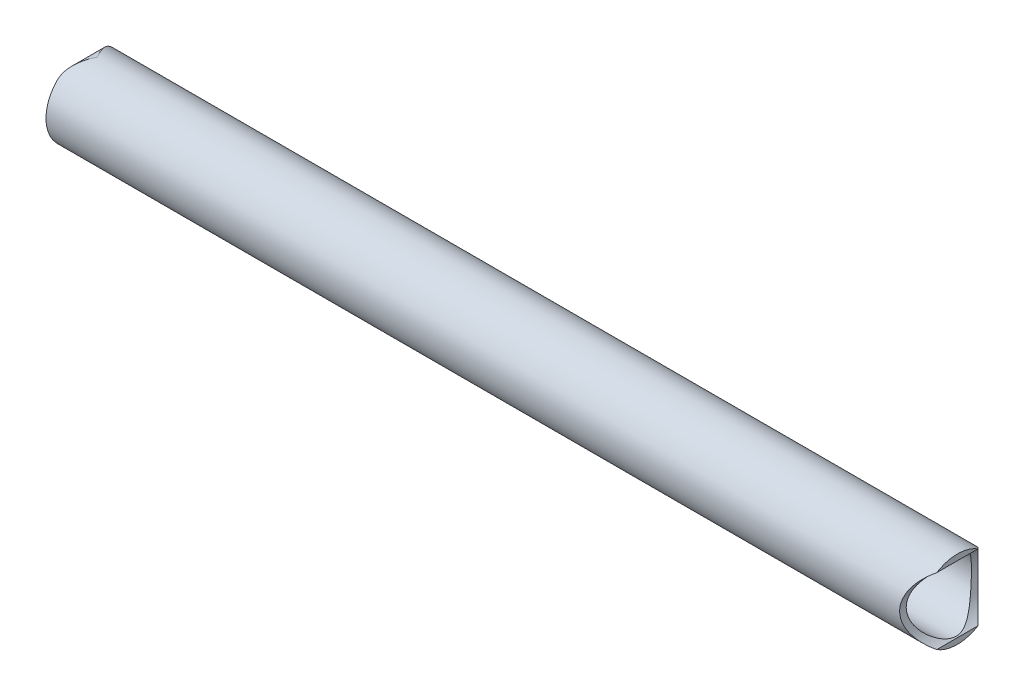
ISO-10303-21;
HEADER;
FILE_DESCRIPTION(('STEP AP214'),'2;1');
FILE_NAME('part.step','',(''),(''),'','','');
FILE_SCHEMA(('AUTOMOTIVE_DESIGN { 1 0 10303 214 1 1 1 1 }'));
ENDSEC;
DATA;
#1=APPLICATION_CONTEXT('core data for automotive mechanical design processes');
#2=APPLICATION_PROTOCOL_DEFINITION('international standard','automotive_design',2000,#1);
#3=PRODUCT_CONTEXT('',#1,'mechanical');
#4=PRODUCT('Part','Part','',(#3));
#5=PRODUCT_RELATED_PRODUCT_CATEGORY('part','',(#4));
#6=PRODUCT_DEFINITION_FORMATION('','',#4);
#7=PRODUCT_DEFINITION_CONTEXT('part definition',#1,'design');
#8=PRODUCT_DEFINITION('design','',#6,#7);
#9=PRODUCT_DEFINITION_SHAPE('','',#8);
#10=(LENGTH_UNIT() NAMED_UNIT(*) SI_UNIT(.MILLI.,.METRE.));
#11=(NAMED_UNIT(*) PLANE_ANGLE_UNIT() SI_UNIT($,.RADIAN.));
#12=(NAMED_UNIT(*) SI_UNIT($,.STERADIAN.) SOLID_ANGLE_UNIT());
#13=UNCERTAINTY_MEASURE_WITH_UNIT(LENGTH_MEASURE(1.E-05),#10,'distance_accuracy_value','');
#14=(GEOMETRIC_REPRESENTATION_CONTEXT(3) GLOBAL_UNCERTAINTY_ASSIGNED_CONTEXT((#13)) GLOBAL_UNIT_ASSIGNED_CONTEXT((#10,
#11,#12)) REPRESENTATION_CONTEXT('',''));
#15=CARTESIAN_POINT('',(0.,0.,0.));
#16=DIRECTION('',(0.,0.,1.));
#17=DIRECTION('',(1.,0.,0.));
#18=AXIS2_PLACEMENT_3D('',#15,#16,#17);
#19=CARTESIAN_POINT('',(469.10625,0.,0.));
#20=DIRECTION('',(1.,0.,0.));
#21=DIRECTION('',(0.,0.,-1.));
#22=AXIS2_PLACEMENT_3D('',#19,#20,#21);
#23=PLANE('',#22);
#24=DIRECTION('',(0.,0.,1.));
#25=VECTOR('',#24,1.);
#26=CARTESIAN_POINT('',(469.10625,17.9154421589309,-21.082));
#27=LINE('',#26,#25);
#28=CARTESIAN_POINT('',(469.10625,17.9154421589309,-11.1125));
#29=VERTEX_POINT('',#28);
#30=CARTESIAN_POINT('',(469.10625,17.915442158931,11.1125));
#31=VERTEX_POINT('',#30);
#32=EDGE_CURVE('E99',#29,#31,#27,.T.);
#33=ORIENTED_EDGE('',*,*,#32,.F.);
#34=CARTESIAN_POINT('',(469.10625,0.,0.));
#35=DIRECTION('',(1.,0.,0.));
#36=DIRECTION('',(0.,0.,-1.));
#37=AXIS2_PLACEMENT_3D('',#34,#35,#36);
#38=CIRCLE('',#37,21.082);
#39=EDGE_CURVE('E59',#29,#31,#38,.T.);
#40=ORIENTED_EDGE('',*,*,#39,.T.);
#41=EDGE_LOOP('',(#33,#40));
#42=FACE_BOUND('',#41,.T.);
#43=ADVANCED_FACE('F44',(#42),#23,.T.);
#44=DIRECTION('',(0.,0.,1.));
#45=VECTOR('',#44,1.);
#46=CARTESIAN_POINT('',(469.10625,-17.9154421589309,-21.082));
#47=LINE('',#46,#45);
#48=CARTESIAN_POINT('',(469.10625,-17.915442158931,11.1125));
#49=VERTEX_POINT('',#48);
#50=CARTESIAN_POINT('',(469.10625,-17.9154421589309,-11.1125));
#51=VERTEX_POINT('',#50);
#52=EDGE_CURVE('E96',#49,#51,#47,.F.);
#53=ORIENTED_EDGE('',*,*,#52,.F.);
#54=EDGE_CURVE('E104',#49,#51,#38,.T.);
#55=ORIENTED_EDGE('',*,*,#54,.T.);
#56=EDGE_LOOP('',(#53,#55));
#57=FACE_BOUND('',#56,.T.);
#58=ADVANCED_FACE('F103',(#57),#23,.T.);
#59=CARTESIAN_POINT('',(0.,0.,0.));
#60=DIRECTION('',(1.,0.,0.));
#61=DIRECTION('',(0.,0.,-1.));
#62=AXIS2_PLACEMENT_3D('',#59,#60,#61);
#63=PLANE('',#62);
#64=CARTESIAN_POINT('',(0.,0.,0.));
#65=DIRECTION('',(1.,0.,0.));
#66=DIRECTION('',(0.,0.,-1.));
#67=AXIS2_PLACEMENT_3D('',#64,#65,#66);
#68=CIRCLE('',#67,21.082);
#69=CARTESIAN_POINT('',(0.,14.732,15.0804144505382));
#70=VERTEX_POINT('',#69);
#71=CARTESIAN_POINT('',(0.,14.732,-15.0804144505382));
#72=VERTEX_POINT('',#71);
#73=EDGE_CURVE('E107',#70,#72,#68,.T.);
#74=ORIENTED_EDGE('',*,*,#73,.F.);
#75=DIRECTION('',(0.,0.,1.));
#76=VECTOR('',#75,1.);
#77=CARTESIAN_POINT('',(0.,14.732,-21.082));
#78=LINE('',#77,#76);
#79=CARTESIAN_POINT('',(0.,14.732,9.49362164824362));
#80=VERTEX_POINT('',#79);
#81=EDGE_CURVE('E137',#80,#70,#78,.T.);
#82=ORIENTED_EDGE('',*,*,#81,.F.);
#83=CARTESIAN_POINT('',(0.,0.,0.));
#84=DIRECTION('',(1.,0.,0.));
#85=DIRECTION('',(0.,0.,-1.));
#86=AXIS2_PLACEMENT_3D('',#83,#84,#85);
#87=CIRCLE('',#86,17.526);
#88=CARTESIAN_POINT('',(0.,14.732,-9.49362164824362));
#89=VERTEX_POINT('',#88);
#90=EDGE_CURVE('E110',#80,#89,#87,.T.);
#91=ORIENTED_EDGE('',*,*,#90,.T.);
#92=EDGE_CURVE('E73',#72,#89,#78,.T.);
#93=ORIENTED_EDGE('',*,*,#92,.F.);
#94=EDGE_LOOP('',(#74,#82,#91,#93));
#95=FACE_BOUND('',#94,.T.);
#96=ADVANCED_FACE('F150',(#95),#63,.F.);
#97=CARTESIAN_POINT('',(469.10625,0.,0.));
#98=DIRECTION('',(-1.,0.,0.));
#99=DIRECTION('',(0.,0.,1.));
#100=AXIS2_PLACEMENT_3D('',#97,#98,#99);
#101=CYLINDRICAL_SURFACE('',#100,21.082);
#102=ORIENTED_EDGE('',*,*,#73,.T.);
#103=CARTESIAN_POINT('',(0.,14.732,-15.0804144505382));
#104=CARTESIAN_POINT('',(4.99777097256306E-06,14.8585166363932,-14.9568250218965));
#105=CARTESIAN_POINT('',(0.0037804024379681,14.9834433145249,-14.8316684363902));
#106=CARTESIAN_POINT('',(0.018344612519162,15.2298802862784,-14.578499414352));
#107=CARTESIAN_POINT('',(0.0291313987626797,15.3513915529794,-14.4504878102679));
#108=CARTESIAN_POINT('',(0.0711641868780703,15.7100653220193,-14.0630095037458));
#109=CARTESIAN_POINT('',(0.112087001365868,15.9418874425845,-13.7995912481011));
#110=CARTESIAN_POINT('',(0.215488507432889,16.3879660671565,-13.2666880799684));
#111=CARTESIAN_POINT('',(0.277765297706076,16.6023646270495,-12.997281336883));
#112=CARTESIAN_POINT('',(0.420807437337394,17.0156387002352,-12.4513482602452));
#113=CARTESIAN_POINT('',(0.501584818248204,17.2145039983668,-12.1748173979638));
#114=CARTESIAN_POINT('',(0.722336490267377,17.6901137279932,-11.4788940830607));
#115=CARTESIAN_POINT('',(0.871915178025879,17.9572278098856,-11.0559422302578));
#116=CARTESIAN_POINT('',(1.19848542775072,18.4567086453977,-10.2003069203716));
#117=CARTESIAN_POINT('',(1.37548494857253,18.6890652721093,-9.76762066916));
#118=CARTESIAN_POINT('',(1.75209895067343,19.1211226362083,-8.89229878891464));
#119=CARTESIAN_POINT('',(1.9518397925665,19.3206241773796,-8.4496197349844));
#120=CARTESIAN_POINT('',(2.36824696498252,19.6862817768882,-7.55863388229215));
#121=CARTESIAN_POINT('',(2.58491234738668,19.8524397012882,-7.11032739995988));
#122=CARTESIAN_POINT('',(3.07854021979459,20.1841782782303,-6.11397748165988));
#123=CARTESIAN_POINT('',(3.35855407719812,20.3421826858222,-5.56492077807607));
#124=CARTESIAN_POINT('',(3.93195657278609,20.6121360645314,-4.46237555433802));
#125=CARTESIAN_POINT('',(4.2253492325938,20.7240710846151,-3.90888574337448));
#126=CARTESIAN_POINT('',(4.81966564824809,20.9026212412311,-2.80091191808466));
#127=CARTESIAN_POINT('',(5.12056407013035,20.9693718110366,-2.24643591433334));
#128=CARTESIAN_POINT('',(5.7263441140806,21.0587059818151,-1.13639917411688));
#129=CARTESIAN_POINT('',(6.0312234277849,21.0813141259917,-0.580839212441869));
#130=CARTESIAN_POINT('',(6.34068566822062,21.0819948744209,-0.0169715207830517));
#131=CARTESIAN_POINT('',(6.34534284661023,21.081999997751,-0.00848573804402203));
#132=CARTESIAN_POINT('',(6.35,21.082,0.));
#133=B_SPLINE_CURVE_WITH_KNOTS('',3,(#103,#104,#105,#106,#107,#108,#109,#110,#111,#112,#113,
#114,#115,#116,#117,#118,#119,#120,#121,#122,#123,#124,#125,#126,#127,#128,#129,#130,#131,#132),
.UNSPECIFIED.,.F.,.F.,(4,2,2,2,2,2,2,2,2,2,2,2,2,2,4),(0.,0.530465682198346,1.06077866603508,
2.11923257632368,3.16794284977036,4.21733708093636,5.78132496799527,7.34576765361523,
8.91937150261676,10.4928872609037,12.3996794344843,14.3070486112538,16.2086751300639,
18.1092440424708,18.1382833302831),.UNSPECIFIED.);
#134=CARTESIAN_POINT('',(6.35,21.082,0.));
#135=VERTEX_POINT('',#134);
#136=EDGE_CURVE('E136',#72,#135,#133,.T.);
#137=ORIENTED_EDGE('',*,*,#136,.T.);
#138=CARTESIAN_POINT('',(0.,14.732,15.0804144505382));
#139=CARTESIAN_POINT('',(4.99777097265902E-06,14.8585166363932,14.9568250218965));
#140=CARTESIAN_POINT('',(0.00378040243796859,14.983443314525,14.8316684363902));
#141=CARTESIAN_POINT('',(0.0183446125191639,15.2298802862785,14.5784994143519));
#142=CARTESIAN_POINT('',(0.0291313987626825,15.3513915529794,14.4504878102678));
#143=CARTESIAN_POINT('',(0.071164186878077,15.7100653220194,14.0630095037458));
#144=CARTESIAN_POINT('',(0.112087001365878,15.9418874425845,13.799591248101));
#145=CARTESIAN_POINT('',(0.215488507432905,16.3879660671565,13.2666880799683));
#146=CARTESIAN_POINT('',(0.277765297706091,16.6023646270495,12.9972813368829));
#147=CARTESIAN_POINT('',(0.420807437337405,17.0156387002352,12.4513482602451));
#148=CARTESIAN_POINT('',(0.501584818248212,17.2145039983668,12.1748173979638));
#149=CARTESIAN_POINT('',(0.722336490267378,17.6901137279932,11.4788940830607));
#150=CARTESIAN_POINT('',(0.871915178025876,17.9572278098856,11.0559422302578));
#151=CARTESIAN_POINT('',(1.19848542775071,18.4567086453976,10.2003069203717));
#152=CARTESIAN_POINT('',(1.37548494857251,18.6890652721093,9.76762066916005));
#153=CARTESIAN_POINT('',(1.75209895067341,19.1211226362082,8.89229878891469));
#154=CARTESIAN_POINT('',(1.95183979256649,19.3206241773795,8.44961973498444));
#155=CARTESIAN_POINT('',(2.36824696498251,19.6862817768881,7.55863388229216));
#156=CARTESIAN_POINT('',(2.58491234738667,19.8524397012882,7.11032739995988));
#157=CARTESIAN_POINT('',(3.0785402197946,20.1841782782303,6.11397748165988));
#158=CARTESIAN_POINT('',(3.35855407719814,20.3421826858222,5.56492077807609));
#159=CARTESIAN_POINT('',(3.93195657278606,20.6121360645314,4.462375554338));
#160=CARTESIAN_POINT('',(4.22534923259369,20.7240710846151,3.90888574337441));
#161=CARTESIAN_POINT('',(4.81966564824822,20.9026212412311,2.80091191808473));
#162=CARTESIAN_POINT('',(5.12056407013078,20.9693718110366,2.24643591433359));
#163=CARTESIAN_POINT('',(5.72634411408013,21.0587059818151,1.13639917411665));
#164=CARTESIAN_POINT('',(6.03122342778322,21.0813141259917,0.580839212440988));
#165=CARTESIAN_POINT('',(6.34068566822056,21.0819948744209,0.0169715207830728));
#166=CARTESIAN_POINT('',(6.3453428466102,21.081999997751,0.00848573804405541));
#167=CARTESIAN_POINT('',(6.35,21.082,0.));
#168=B_SPLINE_CURVE_WITH_KNOTS('',3,(#138,#139,#140,#141,#142,#143,#144,#145,#146,#147,#148,
#149,#150,#151,#152,#153,#154,#155,#156,#157,#158,#159,#160,#161,#162,#163,#164,#165,#166,#167),
.UNSPECIFIED.,.F.,.F.,(4,2,2,2,2,2,2,2,2,2,2,2,2,2,4),(0.,0.530465682198373,1.06077866603513,
2.11923257632378,3.16794284977042,4.21733708093637,5.78132496799524,7.34576765361516,
8.91937150261673,10.4928872609037,12.3996794344843,14.3070486112539,16.2086751300639,
18.1092440424708,18.1382833302831),.UNSPECIFIED.);
#169=EDGE_CURVE('E129',#135,#70,#168,.F.);
#170=ORIENTED_EDGE('',*,*,#169,.T.);
#171=EDGE_LOOP('',(#102,#137,#170));
#172=FACE_BOUND('',#171,.T.);
#173=ORIENTED_EDGE('',*,*,#39,.F.);
#174=CARTESIAN_POINT('',(480.21875,0.,0.));
#175=DIRECTION('',(-0.707106781186548,0.,0.707106781186547));
#176=DIRECTION('',(-0.707106781186548,0.,-0.707106781186547));
#177=AXIS2_PLACEMENT_3D('',#174,#175,#176);
#178=ELLIPSE('',#177,29.8144503219496,21.082);
#179=EDGE_CURVE('E106',#29,#51,#178,.T.);
#180=ORIENTED_EDGE('',*,*,#179,.T.);
#181=ORIENTED_EDGE('',*,*,#54,.F.);
#182=CARTESIAN_POINT('',(480.21875,0.,0.));
#183=DIRECTION('',(-0.707106781186548,0.,-0.707106781186547));
#184=DIRECTION('',(-0.707106781186548,0.,0.707106781186547));
#185=AXIS2_PLACEMENT_3D('',#182,#183,#184);
#186=ELLIPSE('',#185,29.8144503219496,21.082);
#187=EDGE_CURVE('E66',#49,#31,#186,.T.);
#188=ORIENTED_EDGE('',*,*,#187,.T.);
#189=EDGE_LOOP('',(#173,#180,#181,#188));
#190=FACE_BOUND('',#189,.T.);
#191=ADVANCED_FACE('F46',(#172,#190),#101,.T.);
#192=CARTESIAN_POINT('',(469.10625,0.,0.));
#193=DIRECTION('',(-1.,0.,0.));
#194=DIRECTION('',(0.,0.,1.));
#195=AXIS2_PLACEMENT_3D('',#192,#193,#194);
#196=CYLINDRICAL_SURFACE('',#195,17.526);
#197=CARTESIAN_POINT('',(459.13675,0.,17.526));
#198=CARTESIAN_POINT('',(459.136753100232,0.416555730228906,17.525996813955));
#199=CARTESIAN_POINT('',(459.149123313981,0.833163012071545,17.5111221446535));
#200=CARTESIAN_POINT('',(459.198320724751,1.66285085098589,17.4518957288154));
#201=CARTESIAN_POINT('',(459.235152005793,2.0759308074684,17.4075390599622));
#202=CARTESIAN_POINT('',(459.332452439066,2.89546158233793,17.2901260170745));
#203=CARTESIAN_POINT('',(459.392938843433,3.30190733638105,17.2170486963236));
#204=CARTESIAN_POINT('',(459.536212942405,4.10484124386305,17.0434647188049));
#205=CARTESIAN_POINT('',(459.619000210819,4.50132958743919,16.9429585862272));
#206=CARTESIAN_POINT('',(459.804608337995,5.27944797465432,16.7167963170662));
#207=CARTESIAN_POINT('',(459.907303655403,5.66115402240748,16.5912976561353));
#208=CARTESIAN_POINT('',(460.13114125938,6.41026860382347,16.3165047587702));
#209=CARTESIAN_POINT('',(460.252283245215,6.77767737045173,16.1672109102661));
#210=CARTESIAN_POINT('',(460.510997114563,7.49674702968466,15.8465909890381));
#211=CARTESIAN_POINT('',(460.648570010029,7.84840695050787,15.6752635592522));
#212=CARTESIAN_POINT('',(460.938082247339,8.53495429518089,15.3122852034019));
#213=CARTESIAN_POINT('',(461.090024633481,8.86983814178559,15.1206299696701));
#214=CARTESIAN_POINT('',(461.464140089599,9.64160099861961,14.6449374869007));
#215=CARTESIAN_POINT('',(461.691652769384,10.0709113512938,14.3527749107548));
#216=CARTESIAN_POINT('',(462.164488465582,10.8958978241818,13.7370028939555));
#217=CARTESIAN_POINT('',(462.409817485787,11.2915625079794,13.4133828401386));
#218=CARTESIAN_POINT('',(462.913798875036,12.049775776248,12.7366579401323));
#219=CARTESIAN_POINT('',(463.17248335067,12.4122381349312,12.3834806406871));
#220=CARTESIAN_POINT('',(463.697391944567,13.102805813699,11.6503545982694));
#221=CARTESIAN_POINT('',(463.963615114459,13.4309154311957,11.2704092138659));
#222=CARTESIAN_POINT('',(464.503016862729,14.0584742968281,10.4776077506457));
#223=CARTESIAN_POINT('',(464.776233749344,14.3572918160694,10.0642778803075));
#224=CARTESIAN_POINT('',(465.318313078632,14.9191165849368,9.21095532717234));
#225=CARTESIAN_POINT('',(465.587174038226,15.1821118547605,8.77095379548327));
#226=CARTESIAN_POINT('',(466.111691041438,15.6706637077535,7.86481925902692));
#227=CARTESIAN_POINT('',(466.367377460908,15.8963093356672,7.39875205622169));
#228=CARTESIAN_POINT('',(466.855669817722,16.3089147666568,6.43838077354218));
#229=CARTESIAN_POINT('',(467.088295378546,16.4959076106971,5.94410127510899));
#230=CARTESIAN_POINT('',(467.419892415188,16.7529770224336,5.15602712210236));
#231=CARTESIAN_POINT('',(467.531806838252,16.837735543251,4.872411200417));
#232=CARTESIAN_POINT('',(467.741705453925,16.9938564773723,4.29634473218566));
#233=CARTESIAN_POINT('',(467.83968784338,17.0652171570416,4.00389304799845));
#234=CARTESIAN_POINT('',(468.018453347219,17.1934754104678,3.41127303424146));
#235=CARTESIAN_POINT('',(468.099269928926,17.2504011700851,3.11112102298287));
#236=CARTESIAN_POINT('',(468.240783138788,17.3489622258268,2.503748224318));
#237=CARTESIAN_POINT('',(468.301490351692,17.3906055672393,2.19653124698383));
#238=CARTESIAN_POINT('',(468.400642338332,17.4581424184477,1.57275012439623));
#239=CARTESIAN_POINT('',(468.438798088988,17.4838316609619,1.25611705495765));
#240=CARTESIAN_POINT('',(468.489564384314,17.517930419636,0.619877416859227));
#241=CARTESIAN_POINT('',(468.502177230519,17.526341492641,0.300271118708478));
#242=CARTESIAN_POINT('',(468.501123738161,17.5256372212721,-0.338900631657943));
#243=CARTESIAN_POINT('',(468.487455708289,17.5165207489109,-0.658466079921118));
#244=CARTESIAN_POINT('',(468.434638550502,17.4810304342677,-1.29450990358539));
#245=CARTESIAN_POINT('',(468.395486264212,17.454654452937,-1.61098789140883));
#246=CARTESIAN_POINT('',(468.289324257895,17.3822895125155,-2.26597180787558));
#247=CARTESIAN_POINT('',(468.220160695607,17.3347748801548,-2.6039563959663));
#248=CARTESIAN_POINT('',(468.05798050578,17.2213863424108,-3.27094152568147));
#249=CARTESIAN_POINT('',(467.964960013026,17.1555094618906,-3.59994060193884));
#250=CARTESIAN_POINT('',(467.758998964524,17.0065131076897,-4.24855727345));
#251=CARTESIAN_POINT('',(467.64600613574,16.9233482836622,-4.56814761827544));
#252=CARTESIAN_POINT('',(467.404253660727,16.7410384013215,-5.19667563423267));
#253=CARTESIAN_POINT('',(467.275487866865,16.6418871073676,-5.50560909125264));
#254=CARTESIAN_POINT('',(466.927147015409,16.3663636741079,-6.28987340285503));
#255=CARTESIAN_POINT('',(466.698405644521,16.1786783054546,-6.75718011774374));
#256=CARTESIAN_POINT('',(466.221976191773,15.7683263145676,-7.66612047395263));
#257=CARTESIAN_POINT('',(465.974277188512,15.5456394491178,-8.10773905469757));
#258=CARTESIAN_POINT('',(465.468372952079,15.0664754392744,-8.96683638051191));
#259=CARTESIAN_POINT('',(465.21015403316,14.8099532398125,-9.38428185098054));
#260=CARTESIAN_POINT('',(464.690466965766,14.2641231324516,-10.1948087082538));
#261=CARTESIAN_POINT('',(464.428999471574,13.9748217341554,-10.5878949086503));
#262=CARTESIAN_POINT('',(463.895324879337,13.348195218157,-11.368790869149));
#263=CARTESIAN_POINT('',(463.623240901127,13.0091843032674,-11.7553355433847));
#264=CARTESIAN_POINT('',(463.087541373633,12.2951909614096,-12.5002060187878));
#265=CARTESIAN_POINT('',(462.823927094039,11.9202031744408,-12.8585276006225));
#266=CARTESIAN_POINT('',(462.311174827839,11.1350258886843,-13.5441070863272));
#267=CARTESIAN_POINT('',(462.062010084927,10.7249051788906,-13.8714231651622));
#268=CARTESIAN_POINT('',(461.7029705029,10.0834868401277,-14.3371461507588));
#269=CARTESIAN_POINT('',(461.585752726259,9.8653306424743,-14.4881649831134));
#270=CARTESIAN_POINT('',(461.356837871324,9.42027707168284,-14.7814103315513));
#271=CARTESIAN_POINT('',(461.245142151037,9.19337757252926,-14.9236346869964));
#272=CARTESIAN_POINT('',(460.973493112914,8.61498224084044,-15.2678084182525));
#273=CARTESIAN_POINT('',(460.817459068209,8.25811349099297,-15.4639027842676));
#274=CARTESIAN_POINT('',(460.521964191443,7.52616004996061,-15.8330525436508));
#275=CARTESIAN_POINT('',(460.382499423159,7.15107971509298,-16.0061134100713));
#276=CARTESIAN_POINT('',(460.122537175912,6.38410638575886,-16.3271734823368));
#277=CARTESIAN_POINT('',(460.00203301395,5.99221937735624,-16.4751815198914));
#278=CARTESIAN_POINT('',(459.782250109816,5.19343454244432,-16.7441479493523));
#279=CARTESIAN_POINT('',(459.682971726726,4.78653646212599,-16.8651058836479));
#280=CARTESIAN_POINT('',(459.507089403541,3.95712937963007,-17.0788335101842));
#281=CARTESIAN_POINT('',(459.430663185674,3.53452536865489,-17.1713824047497));
#282=CARTESIAN_POINT('',(459.30330895774,2.67986601870688,-17.325342710614));
#283=CARTESIAN_POINT('',(459.252380994275,2.24781066246181,-17.3867540650041));
#284=CARTESIAN_POINT('',(459.177324216148,1.37821649825806,-17.4771905064637));
#285=CARTESIAN_POINT('',(459.153182158585,0.940680508218323,-17.5062315973617));
#286=CARTESIAN_POINT('',(459.132290012414,0.0640313485043037,-17.5313661812511));
#287=CARTESIAN_POINT('',(459.135537074792,-0.37508165237985,-17.5274631010918));
#288=CARTESIAN_POINT('',(459.167335633984,-1.19930498558239,-17.4891990815668));
#289=CARTESIAN_POINT('',(459.192874675364,-1.58470875998572,-17.4584640327402));
#290=CARTESIAN_POINT('',(459.264684232639,-2.35069997583225,-17.3719144045829));
#291=CARTESIAN_POINT('',(459.310952802018,-2.73128786604044,-17.3161021800126));
#292=CARTESIAN_POINT('',(459.42332254399,-3.48513791526224,-17.1802563891461));
#293=CARTESIAN_POINT('',(459.489424907109,-3.85839963308743,-17.1002213688688));
#294=CARTESIAN_POINT('',(459.64024630486,-4.59536738648546,-16.9170761014037));
#295=CARTESIAN_POINT('',(459.724966273857,-4.95907294143571,-16.813964696073));
#296=CARTESIAN_POINT('',(459.913145504431,-5.68108005964255,-16.5840874699882));
#297=CARTESIAN_POINT('',(460.016895992016,-6.03918783157445,-16.4569529541794));
#298=CARTESIAN_POINT('',(460.240467917882,-6.74203119401674,-16.1817226350541));
#299=CARTESIAN_POINT('',(460.360289050715,-7.08676703852215,-16.033627230131));
#300=CARTESIAN_POINT('',(460.614268706947,-7.7617711253795,-15.7179651464271));
#301=CARTESIAN_POINT('',(460.748429245294,-8.09203732526567,-15.5503957309038));
#302=CARTESIAN_POINT('',(461.029307650088,-8.73727082208682,-15.1972398091077));
#303=CARTESIAN_POINT('',(461.176028031205,-9.05223503545283,-15.0116496938153));
#304=CARTESIAN_POINT('',(461.548812920572,-9.80464712063615,-14.5364034891831));
#305=CARTESIAN_POINT('',(461.780846995919,-10.2333578451482,-14.2375288779349));
#306=CARTESIAN_POINT('',(462.262358234905,-11.0565036944503,-13.6081978996813));
#307=CARTESIAN_POINT('',(462.511842112484,-11.4509254939542,-13.2777293585403));
#308=CARTESIAN_POINT('',(463.023748955069,-12.2062013475731,-12.5869774042746));
#309=CARTESIAN_POINT('',(463.286207884647,-12.5669530526875,-12.2266089972621));
#310=CARTESIAN_POINT('',(463.817996141297,-13.253470559835,-11.4788424530418));
#311=CARTESIAN_POINT('',(464.08732447637,-13.5792413783913,-11.091448204724));
#312=CARTESIAN_POINT('',(464.631962798302,-14.2012900820747,-10.2834169092844));
#313=CARTESIAN_POINT('',(464.907294003942,-14.4969406813881,-9.8623113113111));
#314=CARTESIAN_POINT('',(465.452322074852,-15.0517275612925,-8.99289776114401));
#315=CARTESIAN_POINT('',(465.722016777624,-15.3108500388738,-8.54457961710635));
#316=CARTESIAN_POINT('',(466.246222682617,-15.7906628138659,-7.62139093429989));
#317=CARTESIAN_POINT('',(466.500775922646,-16.0114631279653,-7.14660175430663));
#318=CARTESIAN_POINT('',(466.984149383237,-16.4132437140876,-6.16809279152978));
#319=CARTESIAN_POINT('',(467.212994501134,-16.5942626782093,-5.6644017261431));
#320=CARTESIAN_POINT('',(467.533166365567,-16.8388425611419,-4.86810478458098));
#321=CARTESIAN_POINT('',(467.63901918611,-16.9179225696371,-4.58604260557915));
#322=CARTESIAN_POINT('',(467.836250596365,-17.062806654192,-4.01353560636163));
#323=CARTESIAN_POINT('',(467.92763123726,-17.1286126119829,-3.72309198098292));
#324=CARTESIAN_POINT('',(468.092782938295,-17.2459247048064,-3.13503376582409));
#325=CARTESIAN_POINT('',(468.166590343537,-17.2974603903694,-2.83743540296246));
#326=CARTESIAN_POINT('',(468.29389080646,-17.3854671554674,-2.23575303013736));
#327=CARTESIAN_POINT('',(468.347389138256,-17.4219421463683,-1.93167072569972));
#328=CARTESIAN_POINT('',(468.432050986908,-17.4793343349965,-1.31542257105261));
#329=CARTESIAN_POINT('',(468.462959056324,-17.5000736934338,-1.00320440672016));
#330=CARTESIAN_POINT('',(468.499785417953,-17.524756770186,-0.376634351053846));
#331=CARTESIAN_POINT('',(468.505705534394,-17.5287017145648,-0.0622826171578791));
#332=CARTESIAN_POINT('',(468.492219236601,-17.519682115217,0.565765427557123));
#333=CARTESIAN_POINT('',(468.472801625762,-17.5067100959756,0.87946138722474));
#334=CARTESIAN_POINT('',(468.409708218613,-17.4642111799082,1.50326166249684));
#335=CARTESIAN_POINT('',(468.366029014212,-17.4346819572413,1.8133654672525));
#336=CARTESIAN_POINT('',(468.24947913328,-17.3549094765865,2.46783373112703));
#337=CARTESIAN_POINT('',(468.173539424602,-17.302463431889,2.81137909094881));
#338=CARTESIAN_POINT('',(467.99769360765,-17.1787080018257,3.48874159064592));
#339=CARTESIAN_POINT('',(467.897782550923,-17.1073947213456,3.82255670590954));
#340=CARTESIAN_POINT('',(467.678186596836,-16.947078987979,4.48018532937914));
#341=CARTESIAN_POINT('',(467.55845074705,-16.8580308311813,4.80397044519033));
#342=CARTESIAN_POINT('',(467.303531095877,-16.6635408359202,5.44039078400235));
#343=CARTESIAN_POINT('',(467.168341323107,-16.5580926547885,5.75302163536546));
#344=CARTESIAN_POINT('',(466.803678142386,-16.2655608949425,6.54686642927639));
#345=CARTESIAN_POINT('',(466.565311783285,-16.0668060807317,7.0197186237903));
#346=CARTESIAN_POINT('',(466.070778251224,-15.6331071713109,7.93883090279246));
#347=CARTESIAN_POINT('',(465.814601013657,-15.3981425218364,8.38507568297595));
#348=CARTESIAN_POINT('',(465.292991177891,-14.8931005076266,9.25247800104897));
#349=CARTESIAN_POINT('',(465.027546784682,-14.6229771058186,9.67360157184695));
#350=CARTESIAN_POINT('',(464.49479644847,-14.0485414814654,10.4903942108924));
#351=CARTESIAN_POINT('',(464.227490886297,-13.7442360709218,10.8860683262347));
#352=CARTESIAN_POINT('',(463.685008627962,-13.0872302237909,11.6686564771624));
#353=CARTESIAN_POINT('',(463.410011314537,-12.7329783860628,12.0543962817461));
#354=CARTESIAN_POINT('',(462.870324829164,-11.9872775461265,12.7961902436962));
#355=CARTESIAN_POINT('',(462.60563734665,-11.5958224834142,13.1522395466039));
#356=CARTESIAN_POINT('',(462.092856716602,-10.776623787392,13.8313916713883));
#357=CARTESIAN_POINT('',(461.844731277596,-10.3489546907981,14.1545592898452));
#358=CARTESIAN_POINT('',(461.489058671317,-9.6805538418048,14.6123392874479));
#359=CARTESIAN_POINT('',(461.373266967441,-9.45330032462178,14.7604208100894));
#360=CARTESIAN_POINT('',(461.147843154438,-8.98986303225831,15.0471693205303));
#361=CARTESIAN_POINT('',(461.03821252428,-8.7536771354263,15.1858340494738));
#362=CARTESIAN_POINT('',(460.777882456114,-8.16388969440334,15.5135810654738));
#363=CARTESIAN_POINT('',(460.631019615212,-7.80547285234025,15.6971201066552));
#364=CARTESIAN_POINT('',(460.354258282389,-7.07152507053722,16.0411475968501));
#365=CARTESIAN_POINT('',(460.224355748624,-6.69599823719479,16.2016415386992));
#366=CARTESIAN_POINT('',(459.983865788701,-5.92969186792639,16.4975121757086));
#367=CARTESIAN_POINT('',(459.873255954141,-5.53893068115682,16.6329180221441));
#368=CARTESIAN_POINT('',(459.673317296928,-4.74382214338575,16.8768969338328));
#369=CARTESIAN_POINT('',(459.583984673672,-4.33947723349805,16.9854747913174));
#370=CARTESIAN_POINT('',(459.445844180231,-3.61139042732534,17.1529959877094));
#371=CARTESIAN_POINT('',(459.392441530083,-3.2898093654496,17.2176086822695));
#372=CARTESIAN_POINT('',(459.300313709527,-2.64139463379433,17.3289327236608));
#373=CARTESIAN_POINT('',(459.261591366206,-2.31455996491102,17.3756406224611));
#374=CARTESIAN_POINT('',(459.199400717763,-1.657300955975,17.4505998410856));
#375=CARTESIAN_POINT('',(459.175933854947,-1.32687627951213,17.4788494157967));
#376=CARTESIAN_POINT('',(459.144609151471,-0.66431170552806,17.5165484873698));
#377=CARTESIAN_POINT('',(459.136747527795,-0.332172243283639,17.5260025406341));
#378=CARTESIAN_POINT('',(459.13675,0.,17.526));
#379=B_SPLINE_CURVE_WITH_KNOTS('',3,(#197,#198,#199,#200,#201,#202,#203,#204,#205,#206,#207,
#208,#209,#210,#211,#212,#213,#214,#215,#216,#217,#218,#219,#220,#221,#222,#223,#224,#225,#226,
#227,#228,#229,#230,#231,#232,#233,#234,#235,#236,#237,#238,#239,#240,#241,#242,#243,#244,#245,
#246,#247,#248,#249,#250,#251,#252,#253,#254,#255,#256,#257,#258,#259,#260,#261,#262,#263,#264,
#265,#266,#267,#268,#269,#270,#271,#272,#273,#274,#275,#276,#277,#278,#279,#280,#281,#282,#283,
#284,#285,#286,#287,#288,#289,#290,#291,#292,#293,#294,#295,#296,#297,#298,#299,#300,#301,#302,
#303,#304,#305,#306,#307,#308,#309,#310,#311,#312,#313,#314,#315,#316,#317,#318,#319,#320,#321,
#322,#323,#324,#325,#326,#327,#328,#329,#330,#331,#332,#333,#334,#335,#336,#337,#338,#339,#340,
#341,#342,#343,#344,#345,#346,#347,#348,#349,#350,#351,#352,#353,#354,#355,#356,#357,#358,#359,
#360,#361,#362,#363,#364,#365,#366,#367,#368,#369,#370,#371,#372,#373,#374,#375,#376,#377,#378),
.UNSPECIFIED.,.T.,.F.,(4,2,2,2,2,2,2,2,2,2,2,2,2,2,2,2,2,2,2,2,2,2,2,2,2,2,2,2,2,2,2,2,2,2,2,2,
2,2,2,2,2,2,2,2,2,2,2,2,2,2,2,2,2,2,2,2,2,2,2,2,2,2,2,2,2,2,2,2,2,2,2,2,2,2,2,2,2,2,2,2,2,2,2,2,
2,2,2,2,2,2,4),(0.,1.24931215514068,2.49883294793602,3.74926674484587,4.99967664647633,
6.24244384055415,7.48519077601582,8.72801428973392,9.97110169852848,11.6694991969452,
13.3684717049052,15.0717382323203,16.7747914316099,18.508900041403,20.2435871614538,
21.974077138334,23.7030816933734,24.6518793950268,25.6007997833557,26.5478527733324,
27.4944064783684,28.4528421356183,29.4111914294722,30.3696024000782,31.3281321733839,
32.3712679495731,33.4145728378166,34.4606499010713,35.5071359859366,37.1638893836605,
38.8216045193316,40.4815497807695,42.1411659704712,43.8844508919193,45.6279959405214,
47.3682019789461,48.238133531576,49.1082779678088,50.4151915777868,51.7217940919451,
53.0279350344375,54.3340980714494,55.6501696985348,56.9662437309291,58.2816668085292,
59.5969530576398,60.7579780281908,61.9188940006416,63.0798796712698,64.240923621771,
65.4214962902465,66.6020465231705,67.7827628635306,68.9637161565106,70.6766447530631,
72.3902360758568,74.1088773225334,75.8272717729951,77.5762157648221,79.3258188748362,
81.0703129492533,82.8131027115062,83.7469352207905,84.6806352566832,85.6123870984828,
86.5438968054863,87.4857834704328,88.4276013724583,89.3698355997799,90.3122022187916,
91.3777285366849,92.4434750028669,93.5120043575646,94.5809479956882,96.2751844313667,
97.9703861554526,99.6678303471317,101.364936859805,103.137598327809,104.910549063673,
106.679935458133,107.564410898222,108.449097758104,109.733689326203,111.01797419982,
112.300757301213,113.58331109564,114.579500372221,115.575881394522,116.57235660447,
117.568590219854),.UNSPECIFIED.);
#380=CARTESIAN_POINT('',(459.13675,0.,17.526));
#381=VERTEX_POINT('',#380);
#382=EDGE_CURVE('E49',#381,#381,#379,.T.);
#383=ORIENTED_EDGE('',*,*,#382,.F.);
#384=EDGE_LOOP('',(#383));
#385=FACE_BOUND('',#384,.T.);
#386=CARTESIAN_POINT('',(0.,14.732,-9.49362164824361));
#387=CARTESIAN_POINT('',(1.18215827092096E-05,14.8512065552147,-9.30864758850528));
#388=CARTESIAN_POINT('',(0.00335629290756961,14.966903733683,-9.12145207419103));
#389=CARTESIAN_POINT('',(0.015618373053566,15.191067778283,-8.74302268186063));
#390=CARTESIAN_POINT('',(0.024534469369689,15.2995365978256,-8.55178991342886));
#391=CARTESIAN_POINT('',(0.0468365894807759,15.5089823218411,-8.16580160022169));
#392=CARTESIAN_POINT('',(0.0602176995159619,15.6099673136364,-7.97105014964136));
#393=CARTESIAN_POINT('',(0.0904463086584942,15.8044598611726,-7.57811282719616));
#394=CARTESIAN_POINT('',(0.107294062917175,15.8979668658161,-7.3799267035169));
#395=CARTESIAN_POINT('',(0.161710749515973,16.1677428894095,-6.77922295697602));
#396=CARTESIAN_POINT('',(0.203066270989696,16.3325710230985,-6.37184299640371));
#397=CARTESIAN_POINT('',(0.28865530712156,16.6311343918077,-5.5460775193833));
#398=CARTESIAN_POINT('',(0.332889819449679,16.7648587740876,-5.12768821805969));
#399=CARTESIAN_POINT('',(0.420233364203613,17.0075279308424,-4.25683335736751));
#400=CARTESIAN_POINT('',(0.463124929061231,17.1145638855675,-3.80380674958994));
#401=CARTESIAN_POINT('',(0.519476718498732,17.2479052083383,-3.11843895481312));
#402=CARTESIAN_POINT('',(0.536930761583319,17.2878189125596,-2.88899376313145));
#403=CARTESIAN_POINT('',(0.568518618471742,17.3584967782642,-2.42847866805183));
#404=CARTESIAN_POINT('',(0.582652788803805,17.3892619223255,-2.19740894186361));
#405=CARTESIAN_POINT('',(0.60700831203503,17.4414967310561,-1.73463327297525));
#406=CARTESIAN_POINT('',(0.617239840917754,17.4629905896764,-1.50293059363321));
#407=CARTESIAN_POINT('',(0.633438941414769,17.4967389939057,-1.03872466306625));
#408=CARTESIAN_POINT('',(0.639406934130212,17.5089944519799,-0.806221493184098));
#409=CARTESIAN_POINT('',(0.646841906691908,17.5242321079992,-0.340835958369956));
#410=CARTESIAN_POINT('',(0.648308834845186,17.5272141994432,-0.107953589113738));
#411=CARTESIAN_POINT('',(0.646683444701061,17.5238958672413,0.357727673351307));
#412=CARTESIAN_POINT('',(0.64359113409545,17.5175954592557,0.590526566700303));
#413=CARTESIAN_POINT('',(0.633015011982841,17.4958254842557,1.05357258230511));
#414=CARTESIAN_POINT('',(0.625569519654457,17.4804359133699,1.28382432502859));
#415=CARTESIAN_POINT('',(0.606616305295421,17.4405997328694,1.74338121783046));
#416=CARTESIAN_POINT('',(0.595108185917324,17.416152237328,1.97268627309738));
#417=CARTESIAN_POINT('',(0.555116369049375,17.3293085585805,2.65858155894497));
#418=CARTESIAN_POINT('',(0.521163416818214,17.2534079290171,3.11322070575031));
#419=CARTESIAN_POINT('',(0.443683996229778,17.0661243267718,4.01506176899039));
#420=CARTESIAN_POINT('',(0.400139881988926,16.9546757811965,4.4622483212256));
#421=CARTESIAN_POINT('',(0.31015365623528,16.6970370744889,5.34616265629826));
#422=CARTESIAN_POINT('',(0.263712022198695,16.5508526263209,5.78289214600579));
#423=CARTESIAN_POINT('',(0.190296116221632,16.2789916862365,6.49992819615105));
#424=CARTESIAN_POINT('',(0.162003200675152,16.1627907207943,6.78372963515089));
#425=CARTESIAN_POINT('',(0.109990072823221,15.9155254057193,7.34511810644267));
#426=CARTESIAN_POINT('',(0.0862682339282398,15.7844663697057,7.62270731812361));
#427=CARTESIAN_POINT('',(0.0460592939801918,15.5080873202831,8.17029076843601));
#428=CARTESIAN_POINT('',(0.0295522145321793,15.3628080690132,8.44030401764001));
#429=CARTESIAN_POINT('',(0.00654051357353983,15.0579847067746,8.9728539714487));
#430=CARTESIAN_POINT('',(4.36685221627461E-05,14.898429607302,9.23538470802819));
#431=CARTESIAN_POINT('',(0.,14.732,9.49362164824361));
#432=B_SPLINE_CURVE_WITH_KNOTS('',3,(#386,#387,#388,#389,#390,#391,#392,#393,#394,#395,#396,
#397,#398,#399,#400,#401,#402,#403,#404,#405,#406,#407,#408,#409,#410,#411,#412,#413,#414,#415,
#416,#417,#418,#419,#420,#421,#422,#423,#424,#425,#426,#427,#428,#429,#430,#431),.UNSPECIFIED.,
.F.,.F.,(4,2,2,2,2,2,2,2,2,2,2,2,2,2,2,2,2,2,2,2,2,2,4),(0.,0.660061225427474,1.31994334467436,
1.97910164384406,2.6383084756313,3.96109639181251,5.2843451659066,6.68505552254074,
7.38551890925716,8.08590703728532,8.78445623939876,9.48293643762741,10.1814246575994,
10.8799116991686,11.5723409064333,12.2648378558842,13.6496257450175,15.0369829791431,
16.4241121943468,17.3476269451524,18.2708124595747,19.1914251291658,20.1127526175606),.UNSPECIFIED.);
#433=EDGE_CURVE('E13',#89,#80,#432,.T.);
#434=ORIENTED_EDGE('',*,*,#433,.F.);
#435=ORIENTED_EDGE('',*,*,#90,.F.);
#436=EDGE_LOOP('',(#434,#435));
#437=FACE_BOUND('',#436,.T.);
#438=ADVANCED_FACE('F119',(#385,#437),#196,.F.);
#439=CARTESIAN_POINT('',(6.35,14.732,-21.082));
#440=DIRECTION('',(0.,0.,1.));
#441=DIRECTION('',(1.,0.,0.));
#442=AXIS2_PLACEMENT_3D('',#439,#440,#441);
#443=CYLINDRICAL_SURFACE('',#442,6.35);
#444=ORIENTED_EDGE('',*,*,#92,.T.);
#445=ORIENTED_EDGE('',*,*,#433,.T.);
#446=ORIENTED_EDGE('',*,*,#81,.T.);
#447=ORIENTED_EDGE('',*,*,#169,.F.);
#448=ORIENTED_EDGE('',*,*,#136,.F.);
#449=EDGE_LOOP('',(#444,#445,#446,#447,#448));
#450=FACE_BOUND('',#449,.T.);
#451=ADVANCED_FACE('F122',(#450),#443,.T.);
#452=CARTESIAN_POINT('',(480.21875,0.,-21.082));
#453=DIRECTION('',(0.,0.,1.));
#454=DIRECTION('',(1.,0.,0.));
#455=AXIS2_PLACEMENT_3D('',#452,#453,#454);
#456=CYLINDRICAL_SURFACE('',#455,21.082);
#457=ORIENTED_EDGE('',*,*,#382,.T.);
#458=EDGE_LOOP('',(#457));
#459=FACE_BOUND('',#458,.T.);
#460=ORIENTED_EDGE('',*,*,#32,.T.);
#461=ORIENTED_EDGE('',*,*,#187,.F.);
#462=ORIENTED_EDGE('',*,*,#52,.T.);
#463=ORIENTED_EDGE('',*,*,#179,.F.);
#464=EDGE_LOOP('',(#460,#461,#462,#463));
#465=FACE_BOUND('',#464,.T.);
#466=ADVANCED_FACE('F95',(#459,#465),#456,.F.);
#467=CLOSED_SHELL('',(#43,#58,#96,#191,#438,#451,#466));
#468=MANIFOLD_SOLID_BREP('B2',#467);
#469=ADVANCED_BREP_SHAPE_REPRESENTATION('',(#18,#468),#14);
#470=SHAPE_DEFINITION_REPRESENTATION(#9,#469);
ENDSEC;
END-ISO-10303-21;
